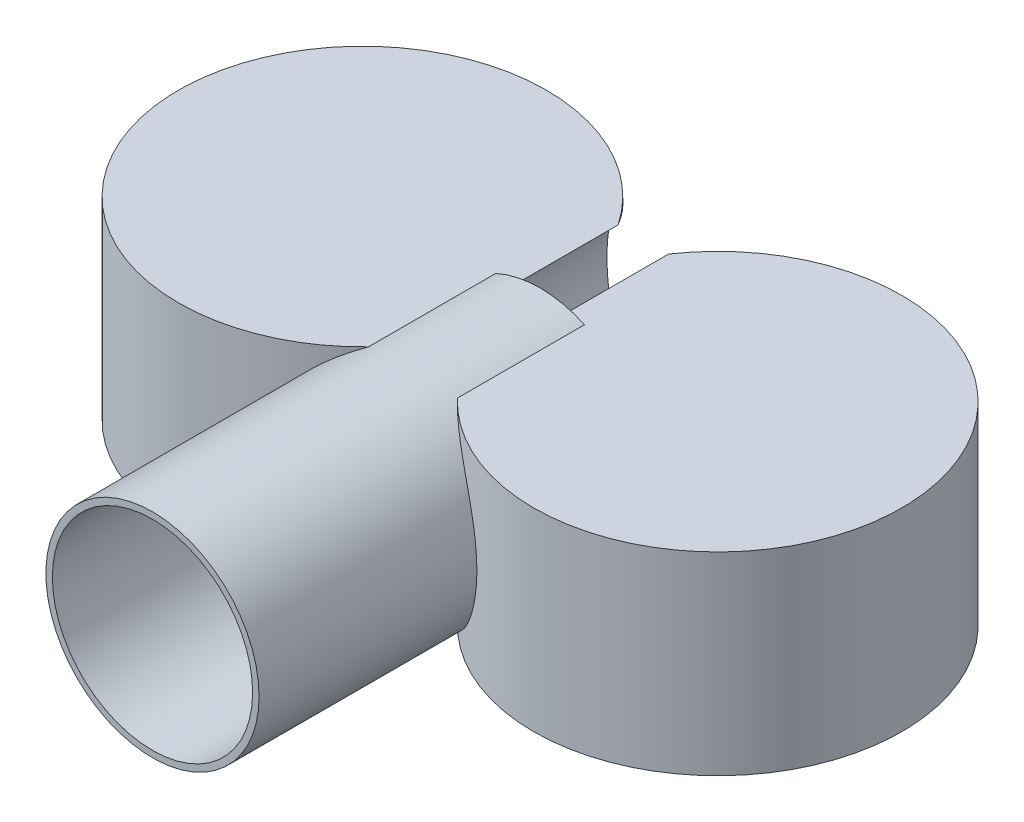
ISO-10303-21;
HEADER;
FILE_DESCRIPTION(('STEP AP214'),'2;1');
FILE_NAME('part.step','',(''),(''),'','','');
FILE_SCHEMA(('AUTOMOTIVE_DESIGN { 1 0 10303 214 1 1 1 1 }'));
ENDSEC;
DATA;
#1=APPLICATION_CONTEXT('core data for automotive mechanical design processes');
#2=APPLICATION_PROTOCOL_DEFINITION('international standard','automotive_design',2000,#1);
#3=PRODUCT_CONTEXT('',#1,'mechanical');
#4=PRODUCT('Part','Part','',(#3));
#5=PRODUCT_RELATED_PRODUCT_CATEGORY('part','',(#4));
#6=PRODUCT_DEFINITION_FORMATION('','',#4);
#7=PRODUCT_DEFINITION_CONTEXT('part definition',#1,'design');
#8=PRODUCT_DEFINITION('design','',#6,#7);
#9=PRODUCT_DEFINITION_SHAPE('','',#8);
#10=(LENGTH_UNIT() NAMED_UNIT(*) SI_UNIT(.MILLI.,.METRE.));
#11=(NAMED_UNIT(*) PLANE_ANGLE_UNIT() SI_UNIT($,.RADIAN.));
#12=(NAMED_UNIT(*) SI_UNIT($,.STERADIAN.) SOLID_ANGLE_UNIT());
#13=UNCERTAINTY_MEASURE_WITH_UNIT(LENGTH_MEASURE(1.E-05),#10,'distance_accuracy_value','');
#14=(GEOMETRIC_REPRESENTATION_CONTEXT(3) GLOBAL_UNCERTAINTY_ASSIGNED_CONTEXT((#13)) GLOBAL_UNIT_ASSIGNED_CONTEXT((#10,
#11,#12)) REPRESENTATION_CONTEXT('',''));
#15=CARTESIAN_POINT('',(0.,0.,0.));
#16=DIRECTION('',(0.,0.,1.));
#17=DIRECTION('',(1.,0.,0.));
#18=AXIS2_PLACEMENT_3D('',#15,#16,#17);
#19=CARTESIAN_POINT('',(-15.0192558049496,30.,0.));
#20=DIRECTION('',(0.,1.,0.));
#21=DIRECTION('',(0.,0.,1.));
#22=AXIS2_PLACEMENT_3D('',#19,#20,#21);
#23=PLANE('',#22);
#24=DIRECTION('',(0.,0.,1.));
#25=VECTOR('',#24,1.);
#26=CARTESIAN_POINT('',(-18.924380642903,30.,-28.5));
#27=LINE('',#26,#25);
#28=CARTESIAN_POINT('',(-18.924380642903,30.,-15.9853641212027));
#29=VERTEX_POINT('',#28);
#30=CARTESIAN_POINT('',(-18.924380642903,30.,0.));
#31=VERTEX_POINT('',#30);
#32=EDGE_CURVE('E60',#29,#31,#27,.T.);
#33=ORIENTED_EDGE('',*,*,#32,.F.);
#34=CARTESIAN_POINT('',(-42.5192558049496,30.,0.));
#35=DIRECTION('',(0.,1.,0.));
#36=DIRECTION('',(0.,0.,1.));
#37=AXIS2_PLACEMENT_3D('',#34,#35,#36);
#38=CIRCLE('',#37,28.5);
#39=CARTESIAN_POINT('',(-21.8931193473834,30.,19.6675492838802));
#40=VERTEX_POINT('',#39);
#41=EDGE_CURVE('E172',#29,#40,#38,.T.);
#42=ORIENTED_EDGE('',*,*,#41,.T.);
#43=DIRECTION('',(0.,0.,-1.));
#44=VECTOR('',#43,1.);
#45=CARTESIAN_POINT('',(-21.8931193473834,30.,60.));
#46=LINE('',#45,#44);
#47=CARTESIAN_POINT('',(-21.8931193473834,30.,0.));
#48=VERTEX_POINT('',#47);
#49=EDGE_CURVE('E143',#40,#48,#46,.T.);
#50=ORIENTED_EDGE('',*,*,#49,.T.);
#51=DIRECTION('',(1.,0.,0.));
#52=VECTOR('',#51,1.);
#53=CARTESIAN_POINT('',(-15.0192558049496,30.,0.));
#54=LINE('',#53,#52);
#55=EDGE_CURVE('E125',#48,#31,#54,.T.);
#56=ORIENTED_EDGE('',*,*,#55,.T.);
#57=EDGE_LOOP('',(#33,#42,#50,#56));
#58=FACE_BOUND('',#57,.T.);
#59=ADVANCED_FACE('F43',(#58),#23,.T.);
#60=CARTESIAN_POINT('',(-15.0192558049496,0.,0.));
#61=DIRECTION('',(0.,1.,0.));
#62=DIRECTION('',(0.,0.,1.));
#63=AXIS2_PLACEMENT_3D('',#60,#61,#62);
#64=PLANE('',#63);
#65=CARTESIAN_POINT('',(-42.5192558049496,0.,0.));
#66=DIRECTION('',(0.,1.,0.));
#67=DIRECTION('',(0.,0.,1.));
#68=AXIS2_PLACEMENT_3D('',#65,#66,#67);
#69=CIRCLE('',#68,28.5);
#70=CARTESIAN_POINT('',(-18.924380642903,0.,-15.9853641212027));
#71=VERTEX_POINT('',#70);
#72=CARTESIAN_POINT('',(-21.8931193473834,0.,19.6675492838802));
#73=VERTEX_POINT('',#72);
#74=EDGE_CURVE('E173',#71,#73,#69,.T.);
#75=ORIENTED_EDGE('',*,*,#74,.F.);
#76=DIRECTION('',(0.,0.,1.));
#77=VECTOR('',#76,1.);
#78=CARTESIAN_POINT('',(-18.924380642903,0.,-28.5));
#79=LINE('',#78,#77);
#80=CARTESIAN_POINT('',(-18.924380642903,0.,0.));
#81=VERTEX_POINT('',#80);
#82=EDGE_CURVE('E209',#71,#81,#79,.T.);
#83=ORIENTED_EDGE('',*,*,#82,.T.);
#84=DIRECTION('',(1.,0.,0.));
#85=VECTOR('',#84,1.);
#86=CARTESIAN_POINT('',(-15.0192558049496,0.,0.));
#87=LINE('',#86,#85);
#88=CARTESIAN_POINT('',(-21.8931193473834,0.,0.));
#89=VERTEX_POINT('',#88);
#90=EDGE_CURVE('E182',#89,#81,#87,.T.);
#91=ORIENTED_EDGE('',*,*,#90,.F.);
#92=DIRECTION('',(0.,0.,-1.));
#93=VECTOR('',#92,1.);
#94=CARTESIAN_POINT('',(-21.8931193473834,0.,60.));
#95=LINE('',#94,#93);
#96=EDGE_CURVE('E186',#73,#89,#95,.T.);
#97=ORIENTED_EDGE('',*,*,#96,.F.);
#98=EDGE_LOOP('',(#75,#83,#91,#97));
#99=FACE_BOUND('',#98,.T.);
#100=ADVANCED_FACE('F236',(#99),#64,.F.);
#101=CARTESIAN_POINT('',(12.4807441950504,30.,0.));
#102=DIRECTION('',(0.,-1.,0.));
#103=DIRECTION('',(0.,0.,-1.));
#104=AXIS2_PLACEMENT_3D('',#101,#102,#103);
#105=CYLINDRICAL_SURFACE('',#104,28.5);
#106=CARTESIAN_POINT('',(12.4807441950504,0.,0.));
#107=DIRECTION('',(0.,1.,0.));
#108=DIRECTION('',(0.,0.,1.));
#109=AXIS2_PLACEMENT_3D('',#106,#107,#108);
#110=CIRCLE('',#109,28.5);
#111=CARTESIAN_POINT('',(-8.14539226251587,0.,19.6675492838802));
#112=VERTEX_POINT('',#111);
#113=CARTESIAN_POINT('',(-11.1141309669963,0.,-15.9853641212027));
#114=VERTEX_POINT('',#113);
#115=EDGE_CURVE('E169',#112,#114,#110,.T.);
#116=ORIENTED_EDGE('',*,*,#115,.T.);
#117=CARTESIAN_POINT('',(-11.1141309669963,0.,-15.9853641212027));
#118=CARTESIAN_POINT('',(-10.9698148915399,0.037575290608443,-16.198383059488));
#119=CARTESIAN_POINT('',(-10.8228565763031,0.0780549423422824,-16.4090796004753));
#120=CARTESIAN_POINT('',(-10.5239332592624,0.165366413400173,-16.8255915694787));
#121=CARTESIAN_POINT('',(-10.3719675471502,0.212199136881096,-17.0314062978175));
#122=CARTESIAN_POINT('',(-9.90864896472385,0.363152205464347,-17.6415967490627));
#123=CARTESIAN_POINT('',(-9.59024097837706,0.477635198620323,-18.0381788580467));
#124=CARTESIAN_POINT('',(-8.93648237990799,0.739058272920426,-18.8098257948294));
#125=CARTESIAN_POINT('',(-8.60104981883999,0.886169691315033,-19.1847633545987));
#126=CARTESIAN_POINT('',(-7.91955529771513,1.21640741270237,-19.9078947623466));
#127=CARTESIAN_POINT('',(-7.57350034844414,1.39951037490088,-20.2561057402949));
#128=CARTESIAN_POINT('',(-6.94076677388687,1.76761102470447,-20.8616833701581));
#129=CARTESIAN_POINT('',(-6.65492813147428,1.94601090279059,-21.1239492734399));
#130=CARTESIAN_POINT('',(-6.08348357967902,2.33033182432214,-21.6278639320427));
#131=CARTESIAN_POINT('',(-5.79787767155232,2.53625301531054,-21.8695125768223));
#132=CARTESIAN_POINT('',(-5.23178014203631,2.97571973425584,-22.3304579653092));
#133=CARTESIAN_POINT('',(-4.95127579530471,3.20918093482675,-22.5498193008891));
#134=CARTESIAN_POINT('',(-4.39875738938085,3.70431087401523,-22.9663260459475));
#135=CARTESIAN_POINT('',(-4.12674320124046,3.96597918395547,-23.1634717929541));
#136=CARTESIAN_POINT('',(-3.59413143620466,4.51837339676529,-23.5362407359433));
#137=CARTESIAN_POINT('',(-3.3336020836928,4.80924609330185,-23.7117441999789));
#138=CARTESIAN_POINT('',(-2.8298109557334,5.41754809044847,-24.040119753438));
#139=CARTESIAN_POINT('',(-2.58654963708602,5.734978093109,-24.1929912442822));
#140=CARTESIAN_POINT('',(-2.12111265986369,6.39470928418426,-24.4767272433053));
#141=CARTESIAN_POINT('',(-1.8989570610651,6.73703359842417,-24.6075709046852));
#142=CARTESIAN_POINT('',(-1.47961267365127,7.44375342447841,-24.8478747560944));
#143=CARTESIAN_POINT('',(-1.28242242889422,7.80814764719766,-24.9573361934766));
#144=CARTESIAN_POINT('',(-0.930100851105237,8.5274688026064,-25.1482856544659));
#145=CARTESIAN_POINT('',(-0.772906984449485,8.88099121222287,-25.2312721364209));
#146=CARTESIAN_POINT('',(-0.484455514394381,9.60182788926494,-25.3807013289966));
#147=CARTESIAN_POINT('',(-0.353196484008373,9.96914139655259,-25.4471449498909));
#148=CARTESIAN_POINT('',(-0.118251974292405,10.7148091932791,-25.5642824300531));
#149=CARTESIAN_POINT('',(-0.014558912909634,11.093160414942,-25.6149806207673));
#150=CARTESIAN_POINT('',(0.164086462405054,11.8582729427586,-25.7013579007011));
#151=CARTESIAN_POINT('',(0.23903841486649,12.2450343546206,-25.7370368010271));
#152=CARTESIAN_POINT('',(0.358945666269278,13.021558975167,-25.7937273882868));
#153=CARTESIAN_POINT('',(0.404099282283152,13.4112845110915,-25.8148360885121));
#154=CARTESIAN_POINT('',(0.464720229381919,14.1935363845432,-25.8431091504898));
#155=CARTESIAN_POINT('',(0.480187818883388,14.5860626976598,-25.8502736336263));
#156=CARTESIAN_POINT('',(0.481271104625398,15.3711947157379,-25.8507765066052));
#157=CARTESIAN_POINT('',(0.466884568092424,15.7638004244416,-25.8441138623244));
#158=CARTESIAN_POINT('',(0.408409684759287,16.5463093305579,-25.8168506271709));
#159=CARTESIAN_POINT('',(0.364321165973079,16.9362125123085,-25.7962499555917));
#160=CARTESIAN_POINT('',(0.246547560216598,17.7130337861955,-25.7406040627205));
#161=CARTESIAN_POINT('',(0.172675980513799,18.0999171102628,-25.7054677869047));
#162=CARTESIAN_POINT('',(-0.00382826023796821,18.8653856324535,-25.6202077431903));
#163=CARTESIAN_POINT('',(-0.106460992746983,19.2439708099567,-25.5700839380537));
#164=CARTESIAN_POINT('',(-0.339270166463332,19.9900610938809,-25.4541573084083));
#165=CARTESIAN_POINT('',(-0.469443175645443,20.3575675743975,-25.3883564374216));
#166=CARTESIAN_POINT('',(-0.75574851134515,21.0788914501548,-25.2402697196024));
#167=CARTESIAN_POINT('',(-0.911880581923978,21.4327089803168,-25.1579840352974));
#168=CARTESIAN_POINT('',(-1.24714859856543,22.1221596763599,-24.9766100907746));
#169=CARTESIAN_POINT('',(-1.4261481764603,22.4578850965401,-24.8776204027843));
#170=CARTESIAN_POINT('',(-1.80547895585598,23.1110244544105,-24.6617400810848));
#171=CARTESIAN_POINT('',(-2.00580995080108,23.4284385693662,-24.544849620707));
#172=CARTESIAN_POINT('',(-2.42502768053228,24.0428817417441,-24.2925455910183));
#173=CARTESIAN_POINT('',(-2.64391026597344,24.3399153308268,-24.1571361596208));
#174=CARTESIAN_POINT('',(-3.0972228342391,24.9120299619995,-23.8673267070686));
#175=CARTESIAN_POINT('',(-3.33165281609832,25.1871110054526,-23.7129266870931));
#176=CARTESIAN_POINT('',(-3.81311073204177,25.71447505759,-23.3847227931279));
#177=CARTESIAN_POINT('',(-4.06015547296224,25.9667263410082,-23.210892645269));
#178=CARTESIAN_POINT('',(-4.56313317011673,26.4472921582391,-22.8441043869662));
#179=CARTESIAN_POINT('',(-4.81906612633058,26.6756066921062,-22.6511462765657));
#180=CARTESIAN_POINT('',(-5.33646215412764,27.1081477199022,-22.2464610110943));
#181=CARTESIAN_POINT('',(-5.59792623142489,27.3123697879635,-22.034730419929));
#182=CARTESIAN_POINT('',(-6.12306356250112,27.6969963480708,-21.5931940583329));
#183=CARTESIAN_POINT('',(-6.38673686560259,27.877400306846,-21.363387883386));
#184=CARTESIAN_POINT('',(-6.93180067252973,28.2270620162871,-20.8697772281921));
#185=CARTESIAN_POINT('',(-7.21313120186671,28.3946401000935,-20.6047181847963));
#186=CARTESIAN_POINT('',(-7.77152479910428,28.7048327973652,-20.0561419671543));
#187=CARTESIAN_POINT('',(-8.04858738659051,28.8474446189992,-19.77262273347));
#188=CARTESIAN_POINT('',(-8.59561884460949,29.1095327469137,-19.1884626607758));
#189=CARTESIAN_POINT('',(-8.86558584913884,29.229003018996,-18.8878173824957));
#190=CARTESIAN_POINT('',(-9.39590318225085,29.4468010533049,-18.2709530871938));
#191=CARTESIAN_POINT('',(-9.65625554887461,29.545133317766,-17.9547374042198));
#192=CARTESIAN_POINT('',(-10.1199794797792,29.7070116174001,-17.3658161217021));
#193=CARTESIAN_POINT('',(-10.3252274593485,29.7736339139427,-17.0954178603031));
#194=CARTESIAN_POINT('',(-10.7265793583902,29.8951904257827,-16.5464706655475));
#195=CARTESIAN_POINT('',(-10.9227056529165,29.9501545628377,-16.2679447376017));
#196=CARTESIAN_POINT('',(-11.1141309669963,30.,-15.9853641212026));
#197=B_SPLINE_CURVE_WITH_KNOTS('',3,(#117,#118,#119,#120,#121,#122,#123,#124,#125,#126,#127,
#128,#129,#130,#131,#132,#133,#134,#135,#136,#137,#138,#139,#140,#141,#142,#143,#144,#145,#146,
#147,#148,#149,#150,#151,#152,#153,#154,#155,#156,#157,#158,#159,#160,#161,#162,#163,#164,#165,
#166,#167,#168,#169,#170,#171,#172,#173,#174,#175,#176,#177,#178,#179,#180,#181,#182,#183,#184,
#185,#186,#187,#188,#189,#190,#191,#192,#193,#194,#195,#196),.UNSPECIFIED.,.F.,.F.,(4,2,2,2,2,2,
2,2,2,2,2,2,2,2,2,2,2,2,2,2,2,2,2,2,2,2,2,2,2,2,2,2,2,2,2,2,2,2,2,4),(0.,0.780013330272559,
1.56013778722355,3.12235859254546,4.69298573471305,6.26259765365358,7.54226923217083,
8.82194767133912,10.0978047652979,11.3736424721615,12.656248851195,13.938889147039,
15.2227365721387,16.5065090803754,17.6921772170663,18.8777800977426,20.0630565387342,
21.2483478861929,22.4256689946421,23.6029798544759,24.7803787679088,25.9577844989985,
27.1426802304798,28.3275789059826,29.5123300081921,30.6970694302506,31.8750475514824,
33.0530142671904,34.2307182045427,35.4084220687762,36.587738170116,37.7670542687784,
38.9465866755621,40.1261454867707,41.3887730859652,42.6515417873671,43.9146393159021,
45.1774675471364,46.2149074273576,47.2496515085438),.UNSPECIFIED.);
#198=CARTESIAN_POINT('',(-11.1141309669963,30.,-15.9853641212027));
#199=VERTEX_POINT('',#198);
#200=EDGE_CURVE('E203',#114,#199,#197,.T.);
#201=ORIENTED_EDGE('',*,*,#200,.T.);
#202=CARTESIAN_POINT('',(12.4807441950504,30.,0.));
#203=DIRECTION('',(0.,1.,0.));
#204=DIRECTION('',(0.,0.,1.));
#205=AXIS2_PLACEMENT_3D('',#202,#203,#204);
#206=CIRCLE('',#205,28.5);
#207=CARTESIAN_POINT('',(-8.14539226251587,30.,19.6675492838802));
#208=VERTEX_POINT('',#207);
#209=EDGE_CURVE('E116',#208,#199,#206,.T.);
#210=ORIENTED_EDGE('',*,*,#209,.F.);
#211=CARTESIAN_POINT('',(-8.14539226251587,0.,19.6675492838802));
#212=CARTESIAN_POINT('',(-7.99490281134393,0.0689637351680742,19.8253777188153));
#213=CARTESIAN_POINT('',(-7.84331661781648,0.141169415745541,19.9807197176665));
#214=CARTESIAN_POINT('',(-7.53833440823604,0.29235568728409,20.2862779609034));
#215=CARTESIAN_POINT('',(-7.38493820850237,0.371336971027385,20.4364936789443));
#216=CARTESIAN_POINT('',(-6.92250680458356,0.618939041139261,20.8793179688179));
#217=CARTESIAN_POINT('',(-6.61137610398584,0.798151452207651,21.163949667695));
#218=CARTESIAN_POINT('',(-5.98704445714219,1.1867950098959,21.7109059069305));
#219=CARTESIAN_POINT('',(-5.67384062125744,1.3962856516262,21.9731848736379));
#220=CARTESIAN_POINT('',(-5.05052133940909,1.84621776586145,22.4736382385072));
#221=CARTESIAN_POINT('',(-4.74040509454101,2.08665099536633,22.7118190262667));
#222=CARTESIAN_POINT('',(-4.12643260529092,2.60010686142585,23.1645840386265));
#223=CARTESIAN_POINT('',(-3.82261690901096,2.8732912241233,23.3790401922598));
#224=CARTESIAN_POINT('',(-3.22790446407828,3.45072294910665,23.7827158282943));
#225=CARTESIAN_POINT('',(-2.93700900841562,3.75497341031918,23.9719327886677));
#226=CARTESIAN_POINT('',(-2.37365857174376,4.39248142032295,24.3250295705733));
#227=CARTESIAN_POINT('',(-2.10116777586473,4.72567956734127,24.4889594482417));
#228=CARTESIAN_POINT('',(-1.57856908451335,5.41947231657808,24.7926823282547));
#229=CARTESIAN_POINT('',(-1.32845926172133,5.78006455482206,24.9324774099135));
#230=CARTESIAN_POINT('',(-0.873273325722112,6.49664780146931,25.1789969843781));
#231=CARTESIAN_POINT('',(-0.66620355136097,6.85078015913512,25.2874555926847));
#232=CARTESIAN_POINT('',(-0.277240549717919,7.57754534327223,25.485908217787));
#233=CARTESIAN_POINT('',(-0.09534614706385,7.9501773049411,25.5759030967005));
#234=CARTESIAN_POINT('',(0.24111973980885,8.71157217485469,25.7386201804381));
#235=CARTESIAN_POINT('',(0.395669463119262,9.10034762904469,25.8113286444002));
#236=CARTESIAN_POINT('',(0.675434846031391,9.89093776073212,25.9404785556728));
#237=CARTESIAN_POINT('',(0.800650148693534,10.2927525968243,25.9969198050468));
#238=CARTESIAN_POINT('',(1.01935190393221,11.1028810048582,26.0940737645737));
#239=CARTESIAN_POINT('',(1.11311127030445,11.5111047041161,26.1349222102884));
#240=CARTESIAN_POINT('',(1.26943606707244,12.3346336230901,26.2023629785676));
#241=CARTESIAN_POINT('',(1.3320018383332,12.7499387653731,26.2289554569131));
#242=CARTESIAN_POINT('',(1.42529143217639,13.5846578115344,26.268413230374));
#243=CARTESIAN_POINT('',(1.4560225255375,14.0040707551254,26.2812816599691));
#244=CARTESIAN_POINT('',(1.48536219890995,14.8442184409503,26.2935700712109));
#245=CARTESIAN_POINT('',(1.48397035115991,15.2649532007114,26.2929898737704));
#246=CARTESIAN_POINT('',(1.44880712574139,16.1113234946539,26.2782560291355));
#247=CARTESIAN_POINT('',(1.4145378443699,16.5369348216451,26.2638936606926));
#248=CARTESIAN_POINT('',(1.31324418967179,17.3835244421473,26.2209832247016));
#249=CARTESIAN_POINT('',(1.24621948017928,17.8045026880641,26.1924350115655));
#250=CARTESIAN_POINT('',(1.08010337950919,18.6389040011107,26.1205584165228));
#251=CARTESIAN_POINT('',(0.981004832877988,19.0523253605875,26.0772267364091));
#252=CARTESIAN_POINT('',(0.75183192530628,19.8685166890205,25.9749561512272));
#253=CARTESIAN_POINT('',(0.621757816643718,20.2712867446958,25.9160173732695));
#254=CARTESIAN_POINT('',(0.332419395905688,21.0624346343161,25.7816519185786));
#255=CARTESIAN_POINT('',(0.173214041247307,21.4508396660204,25.7062584853216));
#256=CARTESIAN_POINT('',(-0.172633971261125,22.2112601377247,25.5377953730888));
#257=CARTESIAN_POINT('',(-0.359276559420045,22.5832756193514,25.4447257390107));
#258=CARTESIAN_POINT('',(-0.757449410175356,23.3079268367166,25.2398551105449));
#259=CARTESIAN_POINT('',(-0.968959057812469,23.6605782744672,25.1280695995914));
#260=CARTESIAN_POINT('',(-1.4141451942524,24.3443778174803,24.8846613121761));
#261=CARTESIAN_POINT('',(-1.64782111123967,24.6755264770715,24.7530390473846));
#262=CARTESIAN_POINT('',(-2.13005516365496,25.3089443767706,24.4714359765212));
#263=CARTESIAN_POINT('',(-2.37830383696251,25.6116002002245,24.3217942091533));
#264=CARTESIAN_POINT('',(-2.88964207940048,26.1925066428449,24.0019194470053));
#265=CARTESIAN_POINT('',(-3.15273182054437,26.4707569790472,23.8316862135363));
#266=CARTESIAN_POINT('',(-3.69041358975006,27.0020994117373,23.4701664873025));
#267=CARTESIAN_POINT('',(-3.96501973541651,27.2551592659142,23.2788536570041));
#268=CARTESIAN_POINT('',(-4.52162683406564,27.7351811335716,22.8754773178899));
#269=CARTESIAN_POINT('',(-4.80362714549111,27.9621454021026,22.6634156050251));
#270=CARTESIAN_POINT('',(-5.3432328757496,28.368889925872,22.2409843465826));
#271=CARTESIAN_POINT('',(-5.60049424317727,28.5511165775878,22.0325196158687));
#272=CARTESIAN_POINT('',(-6.11544538834754,28.8948914403991,21.5996505539569));
#273=CARTESIAN_POINT('',(-6.3731351930476,29.0564382962592,21.3752451795975));
#274=CARTESIAN_POINT('',(-6.88585095641061,29.3591828635777,20.9118134501037));
#275=CARTESIAN_POINT('',(-7.14088202251151,29.5004312741496,20.6728257240407));
#276=CARTESIAN_POINT('',(-7.64676672266483,29.7640725114486,20.1806453225968));
#277=CARTESIAN_POINT('',(-7.89762180699471,29.886472011429,19.9274577180388));
#278=CARTESIAN_POINT('',(-8.14539226251587,30.,19.6675492838802));
#279=B_SPLINE_CURVE_WITH_KNOTS('',3,(#211,#212,#213,#214,#215,#216,#217,#218,#219,#220,#221,
#222,#223,#224,#225,#226,#227,#228,#229,#230,#231,#232,#233,#234,#235,#236,#237,#238,#239,#240,
#241,#242,#243,#244,#245,#246,#247,#248,#249,#250,#251,#252,#253,#254,#255,#256,#257,#258,#259,
#260,#261,#262,#263,#264,#265,#266,#267,#268,#269,#270,#271,#272,#273,#274,#275,#276,#277,#278),
.UNSPECIFIED.,.F.,.F.,(4,2,2,2,2,2,2,2,2,2,2,2,2,2,2,2,2,2,2,2,2,2,2,2,2,2,2,2,2,2,2,2,2,4),(0.,
0.686082984733957,1.37223620290258,2.74521067781374,4.12092060720983,5.49626480785383,
6.87870425345266,8.26128173606583,9.64108626037988,11.0207718493511,12.2922108197156,
13.5635904098871,14.8359772578249,16.1083795872901,17.3694383265287,18.6304832853662,
19.8912401683617,21.152013840088,22.4321874031755,23.71237410484,24.9928466044888,
26.2733086757904,27.5512073787195,28.8291028358159,30.1059462814013,31.3827567976525,
32.6384837095043,33.8942251786866,35.1515537951694,36.4087736777812,37.5417185557815,
38.6747376425349,39.8048756974103,40.934612714642),.UNSPECIFIED.);
#280=EDGE_CURVE('E158',#112,#208,#279,.T.);
#281=ORIENTED_EDGE('',*,*,#280,.F.);
#282=EDGE_LOOP('',(#116,#201,#210,#281));
#283=FACE_BOUND('',#282,.T.);
#284=ADVANCED_FACE('F45',(#283),#105,.T.);
#285=CARTESIAN_POINT('',(-42.5192558049496,30.,0.));
#286=DIRECTION('',(0.,-1.,0.));
#287=DIRECTION('',(0.,0.,-1.));
#288=AXIS2_PLACEMENT_3D('',#285,#286,#287);
#289=CYLINDRICAL_SURFACE('',#288,28.5);
#290=ORIENTED_EDGE('',*,*,#41,.F.);
#291=CARTESIAN_POINT('',(-18.924380642903,30.,-15.9853641212027));
#292=CARTESIAN_POINT('',(-19.0686967183594,29.9624247093916,-16.198383059488));
#293=CARTESIAN_POINT('',(-19.2156550335961,29.9219450576577,-16.4090796004753));
#294=CARTESIAN_POINT('',(-19.5145783506369,29.8346335865998,-16.8255915694787));
#295=CARTESIAN_POINT('',(-19.666544062749,29.7878008631189,-17.0314062978175));
#296=CARTESIAN_POINT('',(-20.1298626451754,29.6368477945357,-17.6415967490627));
#297=CARTESIAN_POINT('',(-20.4482706315222,29.5223648013797,-18.0381788580467));
#298=CARTESIAN_POINT('',(-21.1020292299913,29.2609417270796,-18.8098257948294));
#299=CARTESIAN_POINT('',(-21.4374617910593,29.113830308685,-19.1847633545987));
#300=CARTESIAN_POINT('',(-22.1189563121841,28.7835925872976,-19.9078947623466));
#301=CARTESIAN_POINT('',(-22.4650112614551,28.6004896250991,-20.2561057402949));
#302=CARTESIAN_POINT('',(-23.0977448360124,28.2323889752955,-20.8616833701581));
#303=CARTESIAN_POINT('',(-23.383583478425,28.0539890972094,-21.1239492734399));
#304=CARTESIAN_POINT('',(-23.9550280302202,27.6696681756779,-21.6278639320427));
#305=CARTESIAN_POINT('',(-24.2406339383469,27.4637469846895,-21.8695125768223));
#306=CARTESIAN_POINT('',(-24.806731467863,27.0242802657442,-22.3304579653092));
#307=CARTESIAN_POINT('',(-25.0872358145946,26.7908190651733,-22.5498193008891));
#308=CARTESIAN_POINT('',(-25.6397542205184,26.2956891259848,-22.9663260459475));
#309=CARTESIAN_POINT('',(-25.9117684086588,26.0340208160445,-23.1634717929541));
#310=CARTESIAN_POINT('',(-26.4443801736946,25.4816266032347,-23.5362407359433));
#311=CARTESIAN_POINT('',(-26.7049095262065,25.1907539066982,-23.7117441999789));
#312=CARTESIAN_POINT('',(-27.2087006541659,24.5824519095515,-24.040119753438));
#313=CARTESIAN_POINT('',(-27.4519619728133,24.265021906891,-24.1929912442822));
#314=CARTESIAN_POINT('',(-27.9173989500356,23.6052907158157,-24.4767272433053));
#315=CARTESIAN_POINT('',(-28.1395545488342,23.2629664015758,-24.6075709046852));
#316=CARTESIAN_POINT('',(-28.558898936248,22.5562465755216,-24.8478747560944));
#317=CARTESIAN_POINT('',(-28.756089181005,22.1918523528023,-24.9573361934766));
#318=CARTESIAN_POINT('',(-29.108410758794,21.4725311973936,-25.1482856544659));
#319=CARTESIAN_POINT('',(-29.2656046254498,21.1190087877771,-25.2312721364209));
#320=CARTESIAN_POINT('',(-29.5540560955049,20.3981721107351,-25.3807013289966));
#321=CARTESIAN_POINT('',(-29.6853151258909,20.0308586034474,-25.447144949891));
#322=CARTESIAN_POINT('',(-29.9202596356069,19.285190806721,-25.5642824300531));
#323=CARTESIAN_POINT('',(-30.0239526969896,18.906839585058,-25.6149806207673));
#324=CARTESIAN_POINT('',(-30.2025980723043,18.1417270572414,-25.7013579007011));
#325=CARTESIAN_POINT('',(-30.2775500247658,17.7549656453794,-25.7370368010271));
#326=CARTESIAN_POINT('',(-30.3974572761685,16.978441024833,-25.7937273882868));
#327=CARTESIAN_POINT('',(-30.4426108921824,16.5887154889085,-25.8148360885121));
#328=CARTESIAN_POINT('',(-30.5032318392812,15.8064636154568,-25.8431091504898));
#329=CARTESIAN_POINT('',(-30.5186994287827,15.4139373023402,-25.8502736336263));
#330=CARTESIAN_POINT('',(-30.5197827145247,14.6288052842621,-25.8507765066052));
#331=CARTESIAN_POINT('',(-30.5053961779917,14.2361995755584,-25.8441138623244));
#332=CARTESIAN_POINT('',(-30.4469212946586,13.4536906694421,-25.8168506271709));
#333=CARTESIAN_POINT('',(-30.4028327758723,13.0637874876915,-25.7962499555917));
#334=CARTESIAN_POINT('',(-30.2850591701159,12.2869662138045,-25.7406040627205));
#335=CARTESIAN_POINT('',(-30.2111875904131,11.9000828897372,-25.7054677869047));
#336=CARTESIAN_POINT('',(-30.0346833496613,11.1346143675465,-25.6202077431903));
#337=CARTESIAN_POINT('',(-29.9320506171523,10.7560291900433,-25.5700839380537));
#338=CARTESIAN_POINT('',(-29.6992414434359,10.0099389061191,-25.4541573084083));
#339=CARTESIAN_POINT('',(-29.5690684342538,9.64243242560245,-25.3883564374216));
#340=CARTESIAN_POINT('',(-29.2827630985541,8.92110854984516,-25.2402697196024));
#341=CARTESIAN_POINT('',(-29.1266310279753,8.56729101968317,-25.1579840352974));
#342=CARTESIAN_POINT('',(-28.7913630113338,7.87784032364012,-24.9766100907746));
#343=CARTESIAN_POINT('',(-28.612363433439,7.54211490345987,-24.8776204027843));
#344=CARTESIAN_POINT('',(-28.2330326540433,6.88897554558952,-24.6617400810848));
#345=CARTESIAN_POINT('',(-28.0327016590982,6.57156143063384,-24.544849620707));
#346=CARTESIAN_POINT('',(-27.613483929367,5.95711825825587,-24.2925455910183));
#347=CARTESIAN_POINT('',(-27.3946013439258,5.66008466917323,-24.1571361596208));
#348=CARTESIAN_POINT('',(-26.9412887756602,5.08797003800048,-23.8673267070686));
#349=CARTESIAN_POINT('',(-26.706858793801,4.81288899454742,-23.7129266870931));
#350=CARTESIAN_POINT('',(-26.2254008778575,4.28552494240999,-23.3847227931279));
#351=CARTESIAN_POINT('',(-25.978356136937,4.0332736589918,-23.210892645269));
#352=CARTESIAN_POINT('',(-25.4753784397825,3.55270784176088,-22.8441043869662));
#353=CARTESIAN_POINT('',(-25.2194454835687,3.32439330789382,-22.6511462765657));
#354=CARTESIAN_POINT('',(-24.7020494557716,2.89185228009777,-22.2464610110943));
#355=CARTESIAN_POINT('',(-24.4405853784744,2.68763021203647,-22.0347304199291));
#356=CARTESIAN_POINT('',(-23.9154480473981,2.30300365192923,-21.5931940583329));
#357=CARTESIAN_POINT('',(-23.6517747442967,2.12259969315402,-21.363387883386));
#358=CARTESIAN_POINT('',(-23.1067109373695,1.77293798371285,-20.8697772281921));
#359=CARTESIAN_POINT('',(-22.8253804080326,1.60535989990646,-20.6047181847963));
#360=CARTESIAN_POINT('',(-22.266986810795,1.29516720263481,-20.0561419671543));
#361=CARTESIAN_POINT('',(-21.9899242233088,1.15255538100084,-19.7726227334701));
#362=CARTESIAN_POINT('',(-21.4428927652898,0.890467253086322,-19.1884626607758));
#363=CARTESIAN_POINT('',(-21.1729257607604,0.770996981003983,-18.8878173824957));
#364=CARTESIAN_POINT('',(-20.6426084276484,0.553198946695146,-18.2709530871938));
#365=CARTESIAN_POINT('',(-20.3822560610247,0.454866682234028,-17.9547374042198));
#366=CARTESIAN_POINT('',(-19.9185321301201,0.292988382599936,-17.3658161217021));
#367=CARTESIAN_POINT('',(-19.7132841505508,0.226366086057295,-17.0954178603031));
#368=CARTESIAN_POINT('',(-19.3119322515091,0.104809574217306,-16.5464706655475));
#369=CARTESIAN_POINT('',(-19.1158059569828,0.0498454371622697,-16.2679447376018));
#370=CARTESIAN_POINT('',(-18.924380642903,0.,-15.9853641212027));
#371=B_SPLINE_CURVE_WITH_KNOTS('',3,(#291,#292,#293,#294,#295,#296,#297,#298,#299,#300,#301,
#302,#303,#304,#305,#306,#307,#308,#309,#310,#311,#312,#313,#314,#315,#316,#317,#318,#319,#320,
#321,#322,#323,#324,#325,#326,#327,#328,#329,#330,#331,#332,#333,#334,#335,#336,#337,#338,#339,
#340,#341,#342,#343,#344,#345,#346,#347,#348,#349,#350,#351,#352,#353,#354,#355,#356,#357,#358,
#359,#360,#361,#362,#363,#364,#365,#366,#367,#368,#369,#370),.UNSPECIFIED.,.F.,.F.,(4,2,2,2,2,2,
2,2,2,2,2,2,2,2,2,2,2,2,2,2,2,2,2,2,2,2,2,2,2,2,2,2,2,2,2,2,2,2,2,4),(0.,0.780013330272559,
1.56013778722355,3.12235859254546,4.69298573471304,6.26259765365358,7.54226923217082,
8.82194767133912,10.0978047652979,11.3736424721615,12.656248851195,13.938889147039,
15.2227365721387,16.5065090803754,17.6921772170663,18.8777800977426,20.0630565387342,
21.2483478861929,22.4256689946421,23.6029798544759,24.7803787679088,25.9577844989985,
27.1426802304798,28.3275789059826,29.5123300081921,30.6970694302506,31.8750475514824,
33.0530142671904,34.2307182045427,35.4084220687762,36.587738170116,37.7670542687784,
38.9465866755621,40.1261454867707,41.3887730859652,42.6515417873671,43.9146393159021,
45.1774675471364,46.2149074273576,47.2496515085437),.UNSPECIFIED.);
#372=EDGE_CURVE('E205',#29,#71,#371,.T.);
#373=ORIENTED_EDGE('',*,*,#372,.T.);
#374=ORIENTED_EDGE('',*,*,#74,.T.);
#375=CARTESIAN_POINT('',(-14.0192558049496,31.4696690920006,0.));
#376=CARTESIAN_POINT('',(-14.019253068798,31.4696533487206,0.347728473237274));
#377=CARTESIAN_POINT('',(-14.0256197635774,31.4700550971471,0.695454259047946));
#378=CARTESIAN_POINT('',(-14.0510707532462,31.4715790153191,1.39043590130215));
#379=CARTESIAN_POINT('',(-14.0701549501077,31.4727011795115,1.73769176134726));
#380=CARTESIAN_POINT('',(-14.1210169744521,31.4755512186489,2.43123744184567));
#381=CARTESIAN_POINT('',(-14.1527934499465,31.4772790290777,2.77752736123653));
#382=CARTESIAN_POINT('',(-14.2289910883491,31.4811076943412,3.46869369905681));
#383=CARTESIAN_POINT('',(-14.2734122953144,31.4832085504756,3.813570112557));
#384=CARTESIAN_POINT('',(-14.4261733665654,31.489661809678,4.84950951527658));
#385=CARTESIAN_POINT('',(-14.5537152893694,31.4941419759127,5.53784684230756));
#386=CARTESIAN_POINT('',(-14.8590945217539,31.4999256320134,6.90326642887427));
#387=CARTESIAN_POINT('',(-15.0369363809261,31.5012288344228,7.58034766443686));
#388=CARTESIAN_POINT('',(-15.4722296508433,31.4954292758029,9.01969340511926));
#389=CARTESIAN_POINT('',(-15.7376050370406,31.4870416414204,9.77957246643614));
#390=CARTESIAN_POINT('',(-16.3316490830583,31.4504155290754,11.2741151161633));
#391=CARTESIAN_POINT('',(-16.6603338542177,31.4221719932092,12.0087722297529));
#392=CARTESIAN_POINT('',(-17.1977516882704,31.3565408857479,13.0855633310334));
#393=CARTESIAN_POINT('',(-17.3839877949772,31.3308401770472,13.4397998153158));
#394=CARTESIAN_POINT('',(-17.7708522740876,31.2701288744253,14.139527834501));
#395=CARTESIAN_POINT('',(-17.9714798779305,31.2351187773912,14.4850198350615));
#396=CARTESIAN_POINT('',(-18.3863400201217,31.1541748672234,15.1661227149138));
#397=CARTESIAN_POINT('',(-18.6005635602576,31.1082482248608,15.5017399187315));
#398=CARTESIAN_POINT('',(-19.0419534319987,31.0037293247909,16.1624305933879));
#399=CARTESIAN_POINT('',(-19.2691224656101,30.9451344157575,16.4875018406726));
#400=CARTESIAN_POINT('',(-19.8022229850383,30.7946314685722,17.2175779663637));
#401=CARTESIAN_POINT('',(-20.1120648176709,30.6979888660244,17.6187835683189));
#402=CARTESIAN_POINT('',(-20.7485803892665,30.4770239565935,18.3994912391513));
#403=CARTESIAN_POINT('',(-21.0752489698657,30.3527100941811,18.7789998850008));
#404=CARTESIAN_POINT('',(-21.7417478180095,30.0727778500266,19.5138674179684));
#405=CARTESIAN_POINT('',(-22.0815707201581,29.9171767876707,19.8692395211817));
#406=CARTESIAN_POINT('',(-22.7700610632802,29.5713204740659,20.5537080434566));
#407=CARTESIAN_POINT('',(-23.1187287086634,29.3810644212808,20.8828038545199));
#408=CARTESIAN_POINT('',(-23.8229612803817,28.9611757110668,21.5156890852417));
#409=CARTESIAN_POINT('',(-24.1785603168059,28.731171577569,21.8191954535709));
#410=CARTESIAN_POINT('',(-24.886820471465,28.2313626004,22.3954385368216));
#411=CARTESIAN_POINT('',(-25.2394815573376,27.9615573189221,22.6681749132195));
#412=CARTESIAN_POINT('',(-25.9346605326935,27.3817874541257,23.1816285433158));
#413=CARTESIAN_POINT('',(-26.2771831880623,27.0718421204187,23.4223610334107));
#414=CARTESIAN_POINT('',(-26.9449934690703,26.4125713286622,23.8716219905944));
#415=CARTESIAN_POINT('',(-27.2702838968333,26.063252302222,24.0801557041348));
#416=CARTESIAN_POINT('',(-27.8504844749086,25.3816867616152,24.437176507603));
#417=CARTESIAN_POINT('',(-28.1087047616253,25.0545012260234,24.5899839052307));
#418=CARTESIAN_POINT('',(-28.6035492187842,24.3751531189468,24.8733674643532));
#419=CARTESIAN_POINT('',(-28.8401756633257,24.0229931845336,25.0039459680826));
#420=CARTESIAN_POINT('',(-29.2882783958549,23.2962196495788,25.2439276447455));
#421=CARTESIAN_POINT('',(-29.499756219007,22.9216074217097,25.3533321104764));
#422=CARTESIAN_POINT('',(-29.8945573856045,22.1527711474867,25.5522187527959));
#423=CARTESIAN_POINT('',(-30.0778809170619,21.7585472321214,25.6417010624249));
#424=CARTESIAN_POINT('',(-30.4045372006371,20.9760175400316,25.7975677770882));
#425=CARTESIAN_POINT('',(-30.5495271486917,20.5886022303167,25.8649600903799));
#426=CARTESIAN_POINT('',(-30.8105295454891,19.8018170843404,25.9841553582405));
#427=CARTESIAN_POINT('',(-30.9265434082357,19.4024478324849,26.0359590735427));
#428=CARTESIAN_POINT('',(-31.1283379691942,18.5945557881466,26.1248762469988));
#429=CARTESIAN_POINT('',(-31.2141192943729,18.1860331856742,26.1619900097972));
#430=CARTESIAN_POINT('',(-31.3545644795458,17.3626512511666,26.2222331592533));
#431=CARTESIAN_POINT('',(-31.4092276046973,16.9477917697261,26.2453622156692));
#432=CARTESIAN_POINT('',(-31.4874206181524,16.1088226566931,26.2783265961081));
#433=CARTESIAN_POINT('',(-31.5105093418391,15.6846644545571,26.2879735856419));
#434=CARTESIAN_POINT('',(-31.5238986700838,14.8357398372925,26.293576646844));
#435=CARTESIAN_POINT('',(-31.5141990713175,14.4109734184085,26.2895326336128));
#436=CARTESIAN_POINT('',(-31.4621073551309,13.5637679256074,26.2676657548381));
#437=CARTESIAN_POINT('',(-31.4197124299611,13.1413290547093,26.2498417059175));
#438=CARTESIAN_POINT('',(-31.3026607067077,12.3017865163238,26.2000387862806));
#439=CARTESIAN_POINT('',(-31.2280038567653,11.8846828574135,26.1680598928113));
#440=CARTESIAN_POINT('',(-31.0465763315139,11.0558631038395,26.0890298330008));
#441=CARTESIAN_POINT('',(-30.9395833497271,10.6442055828619,26.0418741779659));
#442=CARTESIAN_POINT('',(-30.6948635930343,9.83230396239517,25.9316744507487));
#443=CARTESIAN_POINT('',(-30.5571366845487,9.43205991252131,25.8686303095099));
#444=CARTESIAN_POINT('',(-30.2525880038487,8.6460087973122,25.725612434442));
#445=CARTESIAN_POINT('',(-30.085771869068,8.26019895222036,25.6456419802576));
#446=CARTESIAN_POINT('',(-29.7250870210288,7.50578062388808,25.4676198826007));
#447=CARTESIAN_POINT('',(-29.5312187786003,7.13717184141977,25.3695685538082));
#448=CARTESIAN_POINT('',(-29.1216083437144,6.42442872416888,25.155629752851));
#449=CARTESIAN_POINT('',(-28.9061792429945,6.0800407586329,25.0399876652081));
#450=CARTESIAN_POINT('',(-28.4542992682224,5.41293018093303,24.7889846681938));
#451=CARTESIAN_POINT('',(-28.2178487118711,5.09020724147129,24.653624056812));
#452=CARTESIAN_POINT('',(-27.7272548482697,4.46845000591818,24.3624305383031));
#453=CARTESIAN_POINT('',(-27.4731156409432,4.16941025459957,24.2066023678233));
#454=CARTESIAN_POINT('',(-26.9506878611967,3.5964372017965,23.873951367455));
#455=CARTESIAN_POINT('',(-26.6823993049979,3.32250387153008,23.6971285616353));
#456=CARTESIAN_POINT('',(-26.1369659058665,2.802138261161,23.3233628106346));
#457=CARTESIAN_POINT('',(-25.8598775767632,2.55556365832286,23.1265352928124));
#458=CARTESIAN_POINT('',(-25.2992511958564,2.08857842539279,22.7121756246258));
#459=CARTESIAN_POINT('',(-25.0157132042445,1.86816755124617,22.4946436674262));
#460=CARTESIAN_POINT('',(-24.4458455319364,1.45327850860283,22.0393930260951));
#461=CARTESIAN_POINT('',(-24.1595154990811,1.25880365802285,21.8016717655622));
#462=CARTESIAN_POINT('',(-23.5875642296997,0.895072461160475,21.3069017234707));
#463=CARTESIAN_POINT('',(-23.3019430272894,0.725817306397698,21.0498520295914));
#464=CARTESIAN_POINT('',(-22.7133932763517,0.399597684219799,20.4976223179876));
#465=CARTESIAN_POINT('',(-22.4107628647263,0.244491644251841,20.2010282985064));
#466=CARTESIAN_POINT('',(-21.8133766309614,-0.0399268903149722,19.588254541552));
#467=CARTESIAN_POINT('',(-21.5186210259548,-0.169238674320382,19.272074264821));
#468=CARTESIAN_POINT('',(-20.9396961163891,-0.404417151850239,18.621553684126));
#469=CARTESIAN_POINT('',(-20.6555321052407,-0.510272249611212,18.2872044996451));
#470=CARTESIAN_POINT('',(-20.1002366706954,-0.700950072828318,17.6020513741062));
#471=CARTESIAN_POINT('',(-19.8291080656403,-0.785768266303977,17.2512439067631));
#472=CARTESIAN_POINT('',(-19.1619699707185,-0.976989533232922,16.344725117072));
#473=CARTESIAN_POINT('',(-18.7759563337317,-1.07099762128761,15.7789798868397));
#474=CARTESIAN_POINT('',(-18.0438625669509,-1.22472766116394,14.6176921991574));
#475=CARTESIAN_POINT('',(-17.6978000175372,-1.28443456443793,14.0221367878156));
#476=CARTESIAN_POINT('',(-17.0483918019206,-1.37804769696081,12.8047633680578));
#477=CARTESIAN_POINT('',(-16.7451329543229,-1.41190208568645,12.1828952163506));
#478=CARTESIAN_POINT('',(-16.184495065957,-1.46120920454035,10.9182790183643));
#479=CARTESIAN_POINT('',(-15.9271099655888,-1.47666436661132,10.2755337430868));
#480=CARTESIAN_POINT('',(-15.4547298396226,-1.49598332641881,8.95885716235199));
#481=CARTESIAN_POINT('',(-15.240766818121,-1.49959038943968,8.28455235794288));
#482=CARTESIAN_POINT('',(-14.8635416922343,-1.50034401618909,6.92180584608839));
#483=CARTESIAN_POINT('',(-14.7002873069254,-1.49748959687192,6.23336200332904));
#484=CARTESIAN_POINT('',(-14.4257173045014,-1.48989179468969,4.84777345894984));
#485=CARTESIAN_POINT('',(-14.3142907028246,-1.48515248891999,4.15065066263541));
#486=CARTESIAN_POINT('',(-14.1435091078161,-1.47696743929907,2.7502951115774));
#487=CARTESIAN_POINT('',(-14.0841285697058,-1.47352106134034,2.0470655254725));
#488=CARTESIAN_POINT('',(-14.0403527789528,-1.47093745744653,1.11906279697058));
#489=CARTESIAN_POINT('',(-14.0324389519013,-1.47046451825005,0.895236976382413));
#490=CARTESIAN_POINT('',(-14.0218928135326,-1.46983041597194,0.447613543194864));
#491=CARTESIAN_POINT('',(-14.019256896426,-1.46966904003764,0.223816015857891));
#492=CARTESIAN_POINT('',(-14.0192558049496,-1.46966909200061,0.));
#493=B_SPLINE_CURVE_WITH_KNOTS('',3,(#375,#376,#377,#378,#379,#380,#381,#382,#383,#384,#385,
#386,#387,#388,#389,#390,#391,#392,#393,#394,#395,#396,#397,#398,#399,#400,#401,#402,#403,#404,
#405,#406,#407,#408,#409,#410,#411,#412,#413,#414,#415,#416,#417,#418,#419,#420,#421,#422,#423,
#424,#425,#426,#427,#428,#429,#430,#431,#432,#433,#434,#435,#436,#437,#438,#439,#440,#441,#442,
#443,#444,#445,#446,#447,#448,#449,#450,#451,#452,#453,#454,#455,#456,#457,#458,#459,#460,#461,
#462,#463,#464,#465,#466,#467,#468,#469,#470,#471,#472,#473,#474,#475,#476,#477,#478,#479,#480,
#481,#482,#483,#484,#485,#486,#487,#488,#489,#490,#491,#492),.UNSPECIFIED.,.F.,.F.,(4,2,2,2,2,2,
2,2,2,2,2,2,2,2,2,2,2,2,2,2,2,2,2,2,2,2,2,2,2,2,2,2,2,2,2,2,2,2,2,2,2,2,2,2,2,2,2,2,2,2,2,2,2,2,
2,2,2,2,4),(0.,1.04312173820048,2.08623543598399,3.12923805033281,4.17224429878775,
6.27036768129864,8.36868089822927,10.7804664758722,13.192866631544,14.395588707182,
15.5982466006207,16.800116674555,18.0022385303253,19.5489681016097,21.0952263011794,
22.6406308967548,24.1860712405734,25.7468242333061,27.3075943953743,28.8676188252245,
30.4273887966814,31.7574685630466,33.0874080934834,34.4172663977975,35.7471158210419,
37.0029966031577,38.258816087579,39.5146095271037,40.7704326204123,42.0436290017376,
43.316833278319,44.5901469049845,45.8634625784218,47.1457393304902,48.4280216558541,
49.7100557530952,50.9920675398858,52.2576055004848,53.5231243380462,54.7883508207869,
56.0535758530558,57.3118755438444,58.570163496319,59.8286122636597,61.0871204683262,
62.4395003163089,63.7919174152042,65.1450015944997,66.4983770160361,68.5692303774177,
70.6409915670321,72.7168963066807,74.7925266303327,76.9128467213586,79.0334894181847,
81.1495698006387,83.2646110051125,83.9364656653413,84.6078611676718),.UNSPECIFIED.);
#494=EDGE_CURVE('E130',#40,#73,#493,.T.);
#495=ORIENTED_EDGE('',*,*,#494,.F.);
#496=EDGE_LOOP('',(#290,#373,#374,#495));
#497=FACE_BOUND('',#496,.T.);
#498=ADVANCED_FACE('F145',(#497),#289,.T.);
#499=DIRECTION('',(0.,0.,1.));
#500=VECTOR('',#499,1.);
#501=CARTESIAN_POINT('',(-11.1141309669963,30.,-28.5));
#502=LINE('',#501,#500);
#503=CARTESIAN_POINT('',(-11.1141309669963,30.,0.));
#504=VERTEX_POINT('',#503);
#505=EDGE_CURVE('E108',#504,#199,#502,.F.);
#506=ORIENTED_EDGE('',*,*,#505,.F.);
#507=CARTESIAN_POINT('',(-8.14539226251587,30.,0.));
#508=VERTEX_POINT('',#507);
#509=EDGE_CURVE('E67',#504,#508,#54,.T.);
#510=ORIENTED_EDGE('',*,*,#509,.T.);
#511=DIRECTION('',(0.,0.,-1.));
#512=VECTOR('',#511,1.);
#513=CARTESIAN_POINT('',(-8.14539226251587,30.,60.));
#514=LINE('',#513,#512);
#515=EDGE_CURVE('E166',#508,#208,#514,.F.);
#516=ORIENTED_EDGE('',*,*,#515,.T.);
#517=ORIENTED_EDGE('',*,*,#209,.T.);
#518=EDGE_LOOP('',(#506,#510,#516,#517));
#519=FACE_BOUND('',#518,.T.);
#520=ADVANCED_FACE('F114',(#519),#23,.T.);
#521=CARTESIAN_POINT('',(-11.1141309669963,0.,0.));
#522=VERTEX_POINT('',#521);
#523=CARTESIAN_POINT('',(-8.14539226251587,0.,0.));
#524=VERTEX_POINT('',#523);
#525=EDGE_CURVE('E176',#522,#524,#87,.T.);
#526=ORIENTED_EDGE('',*,*,#525,.F.);
#527=DIRECTION('',(0.,0.,1.));
#528=VECTOR('',#527,1.);
#529=CARTESIAN_POINT('',(-11.1141309669963,0.,-28.5));
#530=LINE('',#529,#528);
#531=EDGE_CURVE('E201',#522,#114,#530,.F.);
#532=ORIENTED_EDGE('',*,*,#531,.T.);
#533=ORIENTED_EDGE('',*,*,#115,.F.);
#534=DIRECTION('',(0.,0.,-1.));
#535=VECTOR('',#534,1.);
#536=CARTESIAN_POINT('',(-8.14539226251587,0.,60.));
#537=LINE('',#536,#535);
#538=EDGE_CURVE('E53',#524,#112,#537,.F.);
#539=ORIENTED_EDGE('',*,*,#538,.F.);
#540=EDGE_LOOP('',(#526,#532,#533,#539));
#541=FACE_BOUND('',#540,.T.);
#542=ADVANCED_FACE('F199',(#541),#64,.F.);
#543=CARTESIAN_POINT('',(-15.0192558049496,15.,0.));
#544=DIRECTION('',(0.,0.,1.));
#545=DIRECTION('',(1.,0.,0.));
#546=AXIS2_PLACEMENT_3D('',#543,#544,#545);
#547=PLANE('',#546);
#548=ORIENTED_EDGE('',*,*,#90,.T.);
#549=CARTESIAN_POINT('',(-15.0192558049496,15.,0.));
#550=DIRECTION('',(0.,0.,1.));
#551=DIRECTION('',(1.,0.,0.));
#552=AXIS2_PLACEMENT_3D('',#549,#550,#551);
#553=CIRCLE('',#552,15.5);
#554=EDGE_CURVE('E261',#81,#522,#553,.T.);
#555=ORIENTED_EDGE('',*,*,#554,.T.);
#556=ORIENTED_EDGE('',*,*,#525,.T.);
#557=CARTESIAN_POINT('',(-15.0192558049496,15.,0.));
#558=DIRECTION('',(0.,0.,1.));
#559=DIRECTION('',(1.,0.,0.));
#560=AXIS2_PLACEMENT_3D('',#557,#558,#559);
#561=CIRCLE('',#560,16.5);
#562=EDGE_CURVE('E195',#89,#524,#561,.T.);
#563=ORIENTED_EDGE('',*,*,#562,.F.);
#564=EDGE_LOOP('',(#548,#555,#556,#563));
#565=FACE_BOUND('',#564,.T.);
#566=ADVANCED_FACE('F154',(#565),#547,.F.);
#567=CARTESIAN_POINT('',(-15.0192558049496,15.,60.));
#568=DIRECTION('',(0.,0.,-1.));
#569=DIRECTION('',(-1.,0.,0.));
#570=AXIS2_PLACEMENT_3D('',#567,#568,#569);
#571=CYLINDRICAL_SURFACE('',#570,16.5);
#572=ORIENTED_EDGE('',*,*,#515,.F.);
#573=EDGE_CURVE('E123',#508,#48,#561,.T.);
#574=ORIENTED_EDGE('',*,*,#573,.T.);
#575=ORIENTED_EDGE('',*,*,#49,.F.);
#576=ORIENTED_EDGE('',*,*,#494,.T.);
#577=ORIENTED_EDGE('',*,*,#96,.T.);
#578=ORIENTED_EDGE('',*,*,#562,.T.);
#579=ORIENTED_EDGE('',*,*,#538,.T.);
#580=ORIENTED_EDGE('',*,*,#280,.T.);
#581=EDGE_LOOP('',(#572,#574,#575,#576,#577,#578,#579,#580));
#582=FACE_BOUND('',#581,.T.);
#583=CARTESIAN_POINT('',(-15.0192558049496,15.,60.));
#584=DIRECTION('',(0.,0.,1.));
#585=DIRECTION('',(1.,0.,0.));
#586=AXIS2_PLACEMENT_3D('',#583,#584,#585);
#587=CIRCLE('',#586,16.5);
#588=CARTESIAN_POINT('',(1.48074419505037,15.,60.));
#589=VERTEX_POINT('',#588);
#590=EDGE_CURVE('E126',#589,#589,#587,.T.);
#591=ORIENTED_EDGE('',*,*,#590,.F.);
#592=EDGE_LOOP('',(#591));
#593=FACE_BOUND('',#592,.T.);
#594=ADVANCED_FACE('F148',(#582,#593),#571,.T.);
#595=CARTESIAN_POINT('',(-15.0192558049496,15.,60.));
#596=DIRECTION('',(0.,0.,1.));
#597=DIRECTION('',(1.,0.,0.));
#598=AXIS2_PLACEMENT_3D('',#595,#596,#597);
#599=PLANE('',#598);
#600=CARTESIAN_POINT('',(-15.0192558049496,15.,60.));
#601=DIRECTION('',(0.,0.,1.));
#602=DIRECTION('',(1.,0.,0.));
#603=AXIS2_PLACEMENT_3D('',#600,#601,#602);
#604=CIRCLE('',#603,15.5);
#605=CARTESIAN_POINT('',(0.480744195050366,15.,60.));
#606=VERTEX_POINT('',#605);
#607=EDGE_CURVE('E118',#606,#606,#604,.T.);
#608=ORIENTED_EDGE('',*,*,#607,.F.);
#609=EDGE_LOOP('',(#608));
#610=FACE_BOUND('',#609,.T.);
#611=ORIENTED_EDGE('',*,*,#590,.T.);
#612=EDGE_LOOP('',(#611));
#613=FACE_BOUND('',#612,.T.);
#614=ADVANCED_FACE('F153',(#610,#613),#599,.T.);
#615=ORIENTED_EDGE('',*,*,#509,.F.);
#616=CARTESIAN_POINT('',(-15.0192558049496,15.,0.));
#617=DIRECTION('',(0.,0.,1.));
#618=DIRECTION('',(1.,0.,0.));
#619=AXIS2_PLACEMENT_3D('',#616,#617,#618);
#620=CIRCLE('',#619,15.5);
#621=EDGE_CURVE('E11',#504,#31,#620,.T.);
#622=ORIENTED_EDGE('',*,*,#621,.T.);
#623=ORIENTED_EDGE('',*,*,#55,.F.);
#624=ORIENTED_EDGE('',*,*,#573,.F.);
#625=EDGE_LOOP('',(#615,#622,#623,#624));
#626=FACE_BOUND('',#625,.T.);
#627=ADVANCED_FACE('F121',(#626),#547,.F.);
#628=CARTESIAN_POINT('',(-15.0192558049496,15.,-28.5));
#629=DIRECTION('',(0.,0.,1.));
#630=DIRECTION('',(1.,0.,0.));
#631=AXIS2_PLACEMENT_3D('',#628,#629,#630);
#632=CYLINDRICAL_SURFACE('',#631,15.5);
#633=ORIENTED_EDGE('',*,*,#607,.T.);
#634=EDGE_LOOP('',(#633));
#635=FACE_BOUND('',#634,.T.);
#636=ORIENTED_EDGE('',*,*,#82,.F.);
#637=ORIENTED_EDGE('',*,*,#372,.F.);
#638=ORIENTED_EDGE('',*,*,#32,.T.);
#639=ORIENTED_EDGE('',*,*,#621,.F.);
#640=ORIENTED_EDGE('',*,*,#505,.T.);
#641=ORIENTED_EDGE('',*,*,#200,.F.);
#642=ORIENTED_EDGE('',*,*,#531,.F.);
#643=ORIENTED_EDGE('',*,*,#554,.F.);
#644=EDGE_LOOP('',(#636,#637,#638,#639,#640,#641,#642,#643));
#645=FACE_BOUND('',#644,.T.);
#646=ADVANCED_FACE('F107',(#635,#645),#632,.F.);
#647=CLOSED_SHELL('',(#59,#100,#284,#498,#520,#542,#566,#594,#614,#627,#646));
#648=MANIFOLD_SOLID_BREP('B2',#647);
#649=ADVANCED_BREP_SHAPE_REPRESENTATION('',(#18,#648),#14);
#650=SHAPE_DEFINITION_REPRESENTATION(#9,#649);
ENDSEC;
END-ISO-10303-21;
